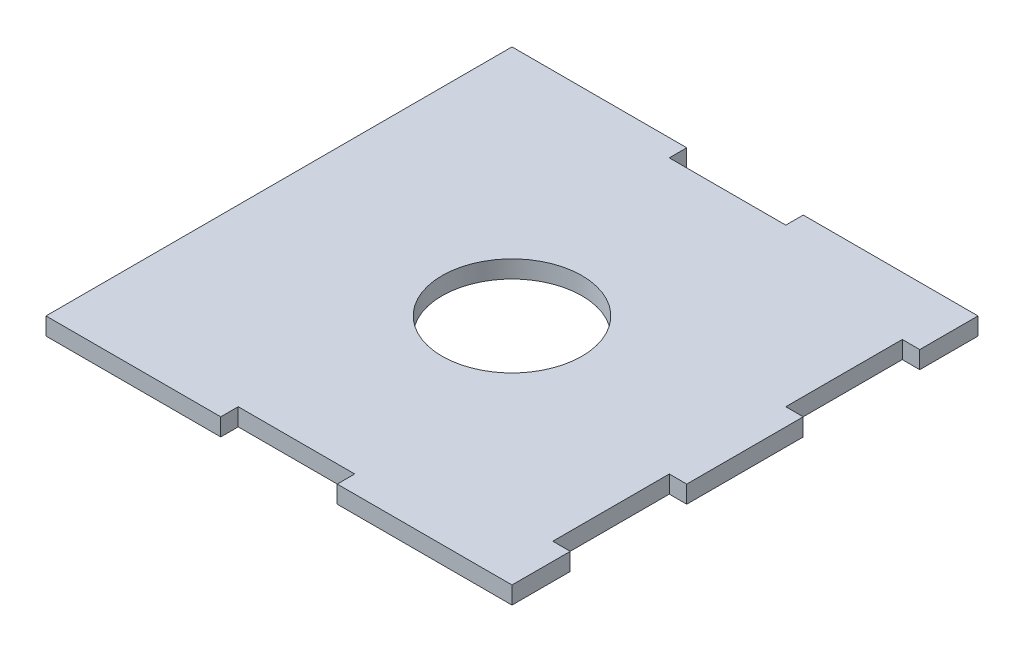
ISO-10303-21;
HEADER;
FILE_DESCRIPTION(('STEP AP214'),'2;1');
FILE_NAME('part.step','',(''),(''),'','','');
FILE_SCHEMA(('AUTOMOTIVE_DESIGN { 1 0 10303 214 1 1 1 1 }'));
ENDSEC;
DATA;
#1=APPLICATION_CONTEXT('core data for automotive mechanical design processes');
#2=APPLICATION_PROTOCOL_DEFINITION('international standard','automotive_design',2000,#1);
#3=PRODUCT_CONTEXT('',#1,'mechanical');
#4=PRODUCT('Part','Part','',(#3));
#5=PRODUCT_RELATED_PRODUCT_CATEGORY('part','',(#4));
#6=PRODUCT_DEFINITION_FORMATION('','',#4);
#7=PRODUCT_DEFINITION_CONTEXT('part definition',#1,'design');
#8=PRODUCT_DEFINITION('design','',#6,#7);
#9=PRODUCT_DEFINITION_SHAPE('','',#8);
#10=(LENGTH_UNIT() NAMED_UNIT(*) SI_UNIT(.MILLI.,.METRE.));
#11=(NAMED_UNIT(*) PLANE_ANGLE_UNIT() SI_UNIT($,.RADIAN.));
#12=(NAMED_UNIT(*) SI_UNIT($,.STERADIAN.) SOLID_ANGLE_UNIT());
#13=UNCERTAINTY_MEASURE_WITH_UNIT(LENGTH_MEASURE(1.E-05),#10,'distance_accuracy_value','');
#14=(GEOMETRIC_REPRESENTATION_CONTEXT(3) GLOBAL_UNCERTAINTY_ASSIGNED_CONTEXT((#13)) GLOBAL_UNIT_ASSIGNED_CONTEXT((#10,
#11,#12)) REPRESENTATION_CONTEXT('',''));
#15=CARTESIAN_POINT('',(0.,0.,0.));
#16=DIRECTION('',(0.,0.,1.));
#17=DIRECTION('',(1.,0.,0.));
#18=AXIS2_PLACEMENT_3D('',#15,#16,#17);
#19=CARTESIAN_POINT('',(0.,3.,0.));
#20=DIRECTION('',(0.,1.,0.));
#21=DIRECTION('',(0.,0.,1.));
#22=AXIS2_PLACEMENT_3D('',#19,#20,#21);
#23=PLANE('',#22);
#24=DIRECTION('',(1.,0.,0.));
#25=VECTOR('',#24,1.);
#26=CARTESIAN_POINT('',(40.,3.,40.));
#27=LINE('',#26,#25);
#28=CARTESIAN_POINT('',(10.0000000000002,3.,40.0000000000003));
#29=VERTEX_POINT('',#28);
#30=CARTESIAN_POINT('',(40.,3.,40.));
#31=VERTEX_POINT('',#30);
#32=EDGE_CURVE('E50',#29,#31,#27,.T.);
#33=ORIENTED_EDGE('',*,*,#32,.T.);
#34=DIRECTION('',(0.,0.,-1.));
#35=VECTOR('',#34,1.);
#36=CARTESIAN_POINT('',(39.9999999999999,3.,30.));
#37=LINE('',#36,#35);
#38=CARTESIAN_POINT('',(39.9999999999999,3.,30.));
#39=VERTEX_POINT('',#38);
#40=EDGE_CURVE('E129',#31,#39,#37,.T.);
#41=ORIENTED_EDGE('',*,*,#40,.T.);
#42=DIRECTION('',(-1.,0.,0.));
#43=VECTOR('',#42,1.);
#44=CARTESIAN_POINT('',(39.9999999999999,3.,30.));
#45=LINE('',#44,#43);
#46=CARTESIAN_POINT('',(36.9999999999998,3.,30.));
#47=VERTEX_POINT('',#46);
#48=EDGE_CURVE('E296',#39,#47,#45,.T.);
#49=ORIENTED_EDGE('',*,*,#48,.T.);
#50=DIRECTION('',(0.,0.,-1.));
#51=VECTOR('',#50,1.);
#52=CARTESIAN_POINT('',(36.9999999999999,3.,10.));
#53=LINE('',#52,#51);
#54=CARTESIAN_POINT('',(36.9999999999999,3.,10.));
#55=VERTEX_POINT('',#54);
#56=EDGE_CURVE('E316',#47,#55,#53,.T.);
#57=ORIENTED_EDGE('',*,*,#56,.T.);
#58=DIRECTION('',(1.,0.,0.));
#59=VECTOR('',#58,1.);
#60=CARTESIAN_POINT('',(36.9999999999999,3.,10.));
#61=LINE('',#60,#59);
#62=CARTESIAN_POINT('',(39.9999999999999,3.,10.));
#63=VERTEX_POINT('',#62);
#64=EDGE_CURVE('E313',#55,#63,#61,.T.);
#65=ORIENTED_EDGE('',*,*,#64,.T.);
#66=DIRECTION('',(0.,0.,-1.));
#67=VECTOR('',#66,1.);
#68=CARTESIAN_POINT('',(39.9999999999999,3.,-10.));
#69=LINE('',#68,#67);
#70=CARTESIAN_POINT('',(39.9999999999999,3.,-10.));
#71=VERTEX_POINT('',#70);
#72=EDGE_CURVE('E315',#63,#71,#69,.T.);
#73=ORIENTED_EDGE('',*,*,#72,.T.);
#74=DIRECTION('',(-1.,0.,0.));
#75=VECTOR('',#74,1.);
#76=CARTESIAN_POINT('',(39.9999999999999,3.,-10.));
#77=LINE('',#76,#75);
#78=CARTESIAN_POINT('',(37.,3.,-10.));
#79=VERTEX_POINT('',#78);
#80=EDGE_CURVE('E318',#71,#79,#77,.T.);
#81=ORIENTED_EDGE('',*,*,#80,.T.);
#82=DIRECTION('',(0.,0.,-1.));
#83=VECTOR('',#82,1.);
#84=CARTESIAN_POINT('',(37.,3.,-30.));
#85=LINE('',#84,#83);
#86=CARTESIAN_POINT('',(37.,3.,-30.));
#87=VERTEX_POINT('',#86);
#88=EDGE_CURVE('E324',#79,#87,#85,.T.);
#89=ORIENTED_EDGE('',*,*,#88,.T.);
#90=DIRECTION('',(1.,0.,0.));
#91=VECTOR('',#90,1.);
#92=CARTESIAN_POINT('',(37.,3.,-30.));
#93=LINE('',#92,#91);
#94=CARTESIAN_POINT('',(40.,3.,-30.));
#95=VERTEX_POINT('',#94);
#96=EDGE_CURVE('E326',#87,#95,#93,.T.);
#97=ORIENTED_EDGE('',*,*,#96,.T.);
#98=DIRECTION('',(0.,0.,-1.));
#99=VECTOR('',#98,1.);
#100=CARTESIAN_POINT('',(40.,3.,-40.));
#101=LINE('',#100,#99);
#102=CARTESIAN_POINT('',(40.,3.,-40.));
#103=VERTEX_POINT('',#102);
#104=EDGE_CURVE('E328',#95,#103,#101,.T.);
#105=ORIENTED_EDGE('',*,*,#104,.T.);
#106=DIRECTION('',(-1.,0.,0.));
#107=VECTOR('',#106,1.);
#108=CARTESIAN_POINT('',(37.,3.,-40.));
#109=LINE('',#108,#107);
#110=CARTESIAN_POINT('',(10.,3.,-40.));
#111=VERTEX_POINT('',#110);
#112=EDGE_CURVE('E330',#103,#111,#109,.T.);
#113=ORIENTED_EDGE('',*,*,#112,.T.);
#114=DIRECTION('',(0.,0.,1.));
#115=VECTOR('',#114,1.);
#116=CARTESIAN_POINT('',(10.,3.,-37.));
#117=LINE('',#116,#115);
#118=CARTESIAN_POINT('',(10.,3.,-37.));
#119=VERTEX_POINT('',#118);
#120=EDGE_CURVE('E332',#111,#119,#117,.T.);
#121=ORIENTED_EDGE('',*,*,#120,.T.);
#122=DIRECTION('',(-1.,0.,0.));
#123=VECTOR('',#122,1.);
#124=CARTESIAN_POINT('',(0.,3.,-37.));
#125=LINE('',#124,#123);
#126=CARTESIAN_POINT('',(-10.,3.,-37.));
#127=VERTEX_POINT('',#126);
#128=EDGE_CURVE('E334',#119,#127,#125,.T.);
#129=ORIENTED_EDGE('',*,*,#128,.T.);
#130=DIRECTION('',(0.,0.,-1.));
#131=VECTOR('',#130,1.);
#132=CARTESIAN_POINT('',(-10.,3.,-37.));
#133=LINE('',#132,#131);
#134=CARTESIAN_POINT('',(-10.,3.,-40.));
#135=VERTEX_POINT('',#134);
#136=EDGE_CURVE('E336',#127,#135,#133,.T.);
#137=ORIENTED_EDGE('',*,*,#136,.T.);
#138=DIRECTION('',(-1.,0.,0.));
#139=VECTOR('',#138,1.);
#140=CARTESIAN_POINT('',(-40.,3.,-40.));
#141=LINE('',#140,#139);
#142=CARTESIAN_POINT('',(-40.,3.,-40.));
#143=VERTEX_POINT('',#142);
#144=EDGE_CURVE('E338',#135,#143,#141,.T.);
#145=ORIENTED_EDGE('',*,*,#144,.T.);
#146=DIRECTION('',(0.,0.,1.));
#147=VECTOR('',#146,1.);
#148=CARTESIAN_POINT('',(-40.,3.,-40.));
#149=LINE('',#148,#147);
#150=CARTESIAN_POINT('',(-40.,3.,40.));
#151=VERTEX_POINT('',#150);
#152=EDGE_CURVE('E340',#143,#151,#149,.T.);
#153=ORIENTED_EDGE('',*,*,#152,.T.);
#154=DIRECTION('',(1.,0.,0.));
#155=VECTOR('',#154,1.);
#156=CARTESIAN_POINT('',(-40.,3.,40.));
#157=LINE('',#156,#155);
#158=CARTESIAN_POINT('',(-9.99999999999984,3.,39.9999999999999));
#159=VERTEX_POINT('',#158);
#160=EDGE_CURVE('E185',#151,#159,#157,.T.);
#161=ORIENTED_EDGE('',*,*,#160,.T.);
#162=DIRECTION('',(0.,0.,-1.));
#163=VECTOR('',#162,1.);
#164=CARTESIAN_POINT('',(-9.99999999999985,3.,36.9999999999999));
#165=LINE('',#164,#163);
#166=CARTESIAN_POINT('',(-9.99999999999985,3.,36.9999999999999));
#167=VERTEX_POINT('',#166);
#168=EDGE_CURVE('E179',#159,#167,#165,.T.);
#169=ORIENTED_EDGE('',*,*,#168,.T.);
#170=DIRECTION('',(1.,0.,0.));
#171=VECTOR('',#170,1.);
#172=CARTESIAN_POINT('',(1.53023059925703E-13,3.,36.9999999999999));
#173=LINE('',#172,#171);
#174=CARTESIAN_POINT('',(10.0000000000002,3.,36.9999999999998));
#175=VERTEX_POINT('',#174);
#176=EDGE_CURVE('E183',#167,#175,#173,.T.);
#177=ORIENTED_EDGE('',*,*,#176,.T.);
#178=DIRECTION('',(0.,0.,1.));
#179=VECTOR('',#178,1.);
#180=CARTESIAN_POINT('',(10.0000000000002,3.,36.9999999999998));
#181=LINE('',#180,#179);
#182=EDGE_CURVE('E200',#175,#29,#181,.T.);
#183=ORIENTED_EDGE('',*,*,#182,.T.);
#184=EDGE_LOOP('',(#33,#41,#49,#57,#65,#73,#81,#89,#97,#105,#113,#121,#129,#137,#145,#153,#161,
#169,#177,#183));
#185=FACE_BOUND('',#184,.T.);
#186=CARTESIAN_POINT('',(0.,3.,0.));
#187=DIRECTION('',(0.,1.,0.));
#188=DIRECTION('',(0.,0.,1.));
#189=AXIS2_PLACEMENT_3D('',#186,#187,#188);
#190=CIRCLE('',#189,12.);
#191=CARTESIAN_POINT('',(0.,3.,12.));
#192=VERTEX_POINT('',#191);
#193=EDGE_CURVE('E209',#192,#192,#190,.T.);
#194=ORIENTED_EDGE('',*,*,#193,.F.);
#195=EDGE_LOOP('',(#194));
#196=FACE_BOUND('',#195,.T.);
#197=ADVANCED_FACE('F33',(#185,#196),#23,.T.);
#198=CARTESIAN_POINT('',(0.,0.,0.));
#199=DIRECTION('',(0.,1.,0.));
#200=DIRECTION('',(0.,0.,1.));
#201=AXIS2_PLACEMENT_3D('',#198,#199,#200);
#202=PLANE('',#201);
#203=DIRECTION('',(0.,0.,-1.));
#204=VECTOR('',#203,1.);
#205=CARTESIAN_POINT('',(39.9999999999999,0.,30.));
#206=LINE('',#205,#204);
#207=CARTESIAN_POINT('',(40.,0.,40.));
#208=VERTEX_POINT('',#207);
#209=CARTESIAN_POINT('',(39.9999999999999,0.,30.));
#210=VERTEX_POINT('',#209);
#211=EDGE_CURVE('E206',#208,#210,#206,.T.);
#212=ORIENTED_EDGE('',*,*,#211,.F.);
#213=DIRECTION('',(1.,0.,0.));
#214=VECTOR('',#213,1.);
#215=CARTESIAN_POINT('',(10.0000000000002,0.,40.0000000000003));
#216=LINE('',#215,#214);
#217=CARTESIAN_POINT('',(10.0000000000002,0.,40.0000000000003));
#218=VERTEX_POINT('',#217);
#219=EDGE_CURVE('E244',#218,#208,#216,.T.);
#220=ORIENTED_EDGE('',*,*,#219,.F.);
#221=DIRECTION('',(0.,0.,1.));
#222=VECTOR('',#221,1.);
#223=CARTESIAN_POINT('',(10.0000000000002,0.,36.9999999999998));
#224=LINE('',#223,#222);
#225=CARTESIAN_POINT('',(10.0000000000002,0.,36.9999999999998));
#226=VERTEX_POINT('',#225);
#227=EDGE_CURVE('E122',#226,#218,#224,.T.);
#228=ORIENTED_EDGE('',*,*,#227,.F.);
#229=DIRECTION('',(1.,0.,0.));
#230=VECTOR('',#229,1.);
#231=CARTESIAN_POINT('',(1.53023059925703E-13,0.,36.9999999999999));
#232=LINE('',#231,#230);
#233=CARTESIAN_POINT('',(-9.99999999999985,0.,36.9999999999999));
#234=VERTEX_POINT('',#233);
#235=EDGE_CURVE('E115',#234,#226,#232,.T.);
#236=ORIENTED_EDGE('',*,*,#235,.F.);
#237=DIRECTION('',(0.,0.,-1.));
#238=VECTOR('',#237,1.);
#239=CARTESIAN_POINT('',(-9.99999999999985,0.,36.9999999999999));
#240=LINE('',#239,#238);
#241=CARTESIAN_POINT('',(-9.99999999999984,0.,39.9999999999999));
#242=VERTEX_POINT('',#241);
#243=EDGE_CURVE('E194',#242,#234,#240,.T.);
#244=ORIENTED_EDGE('',*,*,#243,.F.);
#245=DIRECTION('',(1.,0.,0.));
#246=VECTOR('',#245,1.);
#247=CARTESIAN_POINT('',(-40.,0.,40.));
#248=LINE('',#247,#246);
#249=CARTESIAN_POINT('',(-40.,0.,40.));
#250=VERTEX_POINT('',#249);
#251=EDGE_CURVE('E239',#250,#242,#248,.T.);
#252=ORIENTED_EDGE('',*,*,#251,.F.);
#253=DIRECTION('',(0.,0.,1.));
#254=VECTOR('',#253,1.);
#255=CARTESIAN_POINT('',(-40.,0.,-40.));
#256=LINE('',#255,#254);
#257=CARTESIAN_POINT('',(-40.,0.,-40.));
#258=VERTEX_POINT('',#257);
#259=EDGE_CURVE('E237',#258,#250,#256,.T.);
#260=ORIENTED_EDGE('',*,*,#259,.F.);
#261=DIRECTION('',(-1.,0.,0.));
#262=VECTOR('',#261,1.);
#263=CARTESIAN_POINT('',(-40.,0.,-40.));
#264=LINE('',#263,#262);
#265=CARTESIAN_POINT('',(-10.,0.,-40.));
#266=VERTEX_POINT('',#265);
#267=EDGE_CURVE('E235',#266,#258,#264,.T.);
#268=ORIENTED_EDGE('',*,*,#267,.F.);
#269=DIRECTION('',(0.,0.,-1.));
#270=VECTOR('',#269,1.);
#271=CARTESIAN_POINT('',(-10.,0.,-37.));
#272=LINE('',#271,#270);
#273=CARTESIAN_POINT('',(-10.,0.,-37.));
#274=VERTEX_POINT('',#273);
#275=EDGE_CURVE('E233',#274,#266,#272,.T.);
#276=ORIENTED_EDGE('',*,*,#275,.F.);
#277=DIRECTION('',(-1.,0.,0.));
#278=VECTOR('',#277,1.);
#279=CARTESIAN_POINT('',(0.,0.,-37.));
#280=LINE('',#279,#278);
#281=CARTESIAN_POINT('',(10.,0.,-37.));
#282=VERTEX_POINT('',#281);
#283=EDGE_CURVE('E231',#282,#274,#280,.T.);
#284=ORIENTED_EDGE('',*,*,#283,.F.);
#285=DIRECTION('',(0.,0.,1.));
#286=VECTOR('',#285,1.);
#287=CARTESIAN_POINT('',(10.,0.,-37.));
#288=LINE('',#287,#286);
#289=CARTESIAN_POINT('',(10.,0.,-40.));
#290=VERTEX_POINT('',#289);
#291=EDGE_CURVE('E228',#290,#282,#288,.T.);
#292=ORIENTED_EDGE('',*,*,#291,.F.);
#293=DIRECTION('',(-1.,0.,0.));
#294=VECTOR('',#293,1.);
#295=CARTESIAN_POINT('',(10.,0.,-40.));
#296=LINE('',#295,#294);
#297=CARTESIAN_POINT('',(40.,0.,-40.));
#298=VERTEX_POINT('',#297);
#299=EDGE_CURVE('E226',#298,#290,#296,.T.);
#300=ORIENTED_EDGE('',*,*,#299,.F.);
#301=DIRECTION('',(0.,0.,-1.));
#302=VECTOR('',#301,1.);
#303=CARTESIAN_POINT('',(40.,0.,-40.));
#304=LINE('',#303,#302);
#305=CARTESIAN_POINT('',(40.,0.,-30.));
#306=VERTEX_POINT('',#305);
#307=EDGE_CURVE('E223',#306,#298,#304,.T.);
#308=ORIENTED_EDGE('',*,*,#307,.F.);
#309=DIRECTION('',(1.,0.,0.));
#310=VECTOR('',#309,1.);
#311=CARTESIAN_POINT('',(37.,0.,-30.));
#312=LINE('',#311,#310);
#313=CARTESIAN_POINT('',(37.,0.,-30.));
#314=VERTEX_POINT('',#313);
#315=EDGE_CURVE('E221',#314,#306,#312,.T.);
#316=ORIENTED_EDGE('',*,*,#315,.F.);
#317=DIRECTION('',(0.,0.,-1.));
#318=VECTOR('',#317,1.);
#319=CARTESIAN_POINT('',(37.,0.,-30.));
#320=LINE('',#319,#318);
#321=CARTESIAN_POINT('',(37.,0.,-10.));
#322=VERTEX_POINT('',#321);
#323=EDGE_CURVE('E219',#322,#314,#320,.T.);
#324=ORIENTED_EDGE('',*,*,#323,.F.);
#325=DIRECTION('',(-1.,0.,0.));
#326=VECTOR('',#325,1.);
#327=CARTESIAN_POINT('',(39.9999999999999,0.,-10.));
#328=LINE('',#327,#326);
#329=CARTESIAN_POINT('',(39.9999999999999,0.,-10.));
#330=VERTEX_POINT('',#329);
#331=EDGE_CURVE('E217',#330,#322,#328,.T.);
#332=ORIENTED_EDGE('',*,*,#331,.F.);
#333=DIRECTION('',(0.,0.,-1.));
#334=VECTOR('',#333,1.);
#335=CARTESIAN_POINT('',(39.9999999999999,0.,-10.));
#336=LINE('',#335,#334);
#337=CARTESIAN_POINT('',(39.9999999999999,0.,10.));
#338=VERTEX_POINT('',#337);
#339=EDGE_CURVE('E215',#338,#330,#336,.T.);
#340=ORIENTED_EDGE('',*,*,#339,.F.);
#341=DIRECTION('',(1.,0.,0.));
#342=VECTOR('',#341,1.);
#343=CARTESIAN_POINT('',(36.9999999999999,0.,10.));
#344=LINE('',#343,#342);
#345=CARTESIAN_POINT('',(36.9999999999999,0.,10.));
#346=VERTEX_POINT('',#345);
#347=EDGE_CURVE('E213',#346,#338,#344,.T.);
#348=ORIENTED_EDGE('',*,*,#347,.F.);
#349=DIRECTION('',(0.,0.,-1.));
#350=VECTOR('',#349,1.);
#351=CARTESIAN_POINT('',(36.9999999999999,0.,10.));
#352=LINE('',#351,#350);
#353=CARTESIAN_POINT('',(36.9999999999998,0.,30.));
#354=VERTEX_POINT('',#353);
#355=EDGE_CURVE('E211',#354,#346,#352,.T.);
#356=ORIENTED_EDGE('',*,*,#355,.F.);
#357=DIRECTION('',(-1.,0.,0.));
#358=VECTOR('',#357,1.);
#359=CARTESIAN_POINT('',(39.9999999999999,0.,30.));
#360=LINE('',#359,#358);
#361=EDGE_CURVE('E208',#210,#354,#360,.T.);
#362=ORIENTED_EDGE('',*,*,#361,.F.);
#363=EDGE_LOOP('',(#212,#220,#228,#236,#244,#252,#260,#268,#276,#284,#292,#300,#308,#316,#324,
#332,#340,#348,#356,#362));
#364=FACE_BOUND('',#363,.T.);
#365=CARTESIAN_POINT('',(0.,0.,0.));
#366=DIRECTION('',(0.,1.,0.));
#367=DIRECTION('',(0.,0.,1.));
#368=AXIS2_PLACEMENT_3D('',#365,#366,#367);
#369=CIRCLE('',#368,12.);
#370=CARTESIAN_POINT('',(0.,0.,12.));
#371=VERTEX_POINT('',#370);
#372=EDGE_CURVE('E356',#371,#371,#369,.T.);
#373=ORIENTED_EDGE('',*,*,#372,.T.);
#374=EDGE_LOOP('',(#373));
#375=FACE_BOUND('',#374,.T.);
#376=ADVANCED_FACE('F300',(#364,#375),#202,.F.);
#377=CARTESIAN_POINT('',(39.9999999999999,3.,30.));
#378=DIRECTION('',(-1.,0.,0.));
#379=DIRECTION('',(0.,0.,1.));
#380=AXIS2_PLACEMENT_3D('',#377,#378,#379);
#381=PLANE('',#380);
#382=ORIENTED_EDGE('',*,*,#211,.T.);
#383=DIRECTION('',(0.,-1.,0.));
#384=VECTOR('',#383,1.);
#385=CARTESIAN_POINT('',(39.9999999999999,3.,30.));
#386=LINE('',#385,#384);
#387=EDGE_CURVE('E42',#39,#210,#386,.T.);
#388=ORIENTED_EDGE('',*,*,#387,.F.);
#389=ORIENTED_EDGE('',*,*,#40,.F.);
#390=DIRECTION('',(0.,-1.,0.));
#391=VECTOR('',#390,1.);
#392=CARTESIAN_POINT('',(40.,3.,40.));
#393=LINE('',#392,#391);
#394=EDGE_CURVE('E11',#31,#208,#393,.T.);
#395=ORIENTED_EDGE('',*,*,#394,.T.);
#396=EDGE_LOOP('',(#382,#388,#389,#395));
#397=FACE_BOUND('',#396,.T.);
#398=ADVANCED_FACE('F35',(#397),#381,.F.);
#399=CARTESIAN_POINT('',(39.9999999999999,3.,30.));
#400=DIRECTION('',(0.,0.,1.));
#401=DIRECTION('',(1.,0.,0.));
#402=AXIS2_PLACEMENT_3D('',#399,#400,#401);
#403=PLANE('',#402);
#404=ORIENTED_EDGE('',*,*,#361,.T.);
#405=DIRECTION('',(0.,-1.,0.));
#406=VECTOR('',#405,1.);
#407=CARTESIAN_POINT('',(36.9999999999998,3.,30.));
#408=LINE('',#407,#406);
#409=EDGE_CURVE('E288',#47,#354,#408,.T.);
#410=ORIENTED_EDGE('',*,*,#409,.F.);
#411=ORIENTED_EDGE('',*,*,#48,.F.);
#412=ORIENTED_EDGE('',*,*,#387,.T.);
#413=EDGE_LOOP('',(#404,#410,#411,#412));
#414=FACE_BOUND('',#413,.T.);
#415=ADVANCED_FACE('F294',(#414),#403,.F.);
#416=CARTESIAN_POINT('',(36.9999999999999,3.,10.));
#417=DIRECTION('',(-1.,0.,0.));
#418=DIRECTION('',(0.,0.,1.));
#419=AXIS2_PLACEMENT_3D('',#416,#417,#418);
#420=PLANE('',#419);
#421=ORIENTED_EDGE('',*,*,#355,.T.);
#422=DIRECTION('',(0.,-1.,0.));
#423=VECTOR('',#422,1.);
#424=CARTESIAN_POINT('',(36.9999999999999,3.,10.));
#425=LINE('',#424,#423);
#426=EDGE_CURVE('E285',#55,#346,#425,.T.);
#427=ORIENTED_EDGE('',*,*,#426,.F.);
#428=ORIENTED_EDGE('',*,*,#56,.F.);
#429=ORIENTED_EDGE('',*,*,#409,.T.);
#430=EDGE_LOOP('',(#421,#427,#428,#429));
#431=FACE_BOUND('',#430,.T.);
#432=ADVANCED_FACE('F307',(#431),#420,.F.);
#433=CARTESIAN_POINT('',(36.9999999999999,3.,10.));
#434=DIRECTION('',(0.,0.,-1.));
#435=DIRECTION('',(-1.,0.,0.));
#436=AXIS2_PLACEMENT_3D('',#433,#434,#435);
#437=PLANE('',#436);
#438=ORIENTED_EDGE('',*,*,#347,.T.);
#439=DIRECTION('',(0.,-1.,0.));
#440=VECTOR('',#439,1.);
#441=CARTESIAN_POINT('',(39.9999999999999,3.,10.));
#442=LINE('',#441,#440);
#443=EDGE_CURVE('E282',#63,#338,#442,.T.);
#444=ORIENTED_EDGE('',*,*,#443,.F.);
#445=ORIENTED_EDGE('',*,*,#64,.F.);
#446=ORIENTED_EDGE('',*,*,#426,.T.);
#447=EDGE_LOOP('',(#438,#444,#445,#446));
#448=FACE_BOUND('',#447,.T.);
#449=ADVANCED_FACE('F311',(#448),#437,.F.);
#450=CARTESIAN_POINT('',(39.9999999999999,3.,-10.));
#451=DIRECTION('',(-1.,0.,0.));
#452=DIRECTION('',(0.,0.,1.));
#453=AXIS2_PLACEMENT_3D('',#450,#451,#452);
#454=PLANE('',#453);
#455=ORIENTED_EDGE('',*,*,#339,.T.);
#456=DIRECTION('',(0.,-1.,0.));
#457=VECTOR('',#456,1.);
#458=CARTESIAN_POINT('',(39.9999999999999,3.,-10.));
#459=LINE('',#458,#457);
#460=EDGE_CURVE('E279',#71,#330,#459,.T.);
#461=ORIENTED_EDGE('',*,*,#460,.F.);
#462=ORIENTED_EDGE('',*,*,#72,.F.);
#463=ORIENTED_EDGE('',*,*,#443,.T.);
#464=EDGE_LOOP('',(#455,#461,#462,#463));
#465=FACE_BOUND('',#464,.T.);
#466=ADVANCED_FACE('F419',(#465),#454,.F.);
#467=CARTESIAN_POINT('',(39.9999999999999,3.,-10.));
#468=DIRECTION('',(0.,0.,1.));
#469=DIRECTION('',(1.,0.,0.));
#470=AXIS2_PLACEMENT_3D('',#467,#468,#469);
#471=PLANE('',#470);
#472=ORIENTED_EDGE('',*,*,#331,.T.);
#473=DIRECTION('',(0.,-1.,0.));
#474=VECTOR('',#473,1.);
#475=CARTESIAN_POINT('',(37.,3.,-10.));
#476=LINE('',#475,#474);
#477=EDGE_CURVE('E276',#79,#322,#476,.T.);
#478=ORIENTED_EDGE('',*,*,#477,.F.);
#479=ORIENTED_EDGE('',*,*,#80,.F.);
#480=ORIENTED_EDGE('',*,*,#460,.T.);
#481=EDGE_LOOP('',(#472,#478,#479,#480));
#482=FACE_BOUND('',#481,.T.);
#483=ADVANCED_FACE('F415',(#482),#471,.F.);
#484=CARTESIAN_POINT('',(37.,3.,-30.));
#485=DIRECTION('',(-1.,0.,0.));
#486=DIRECTION('',(0.,0.,1.));
#487=AXIS2_PLACEMENT_3D('',#484,#485,#486);
#488=PLANE('',#487);
#489=ORIENTED_EDGE('',*,*,#323,.T.);
#490=DIRECTION('',(0.,-1.,0.));
#491=VECTOR('',#490,1.);
#492=CARTESIAN_POINT('',(37.,3.,-30.));
#493=LINE('',#492,#491);
#494=EDGE_CURVE('E273',#87,#314,#493,.T.);
#495=ORIENTED_EDGE('',*,*,#494,.F.);
#496=ORIENTED_EDGE('',*,*,#88,.F.);
#497=ORIENTED_EDGE('',*,*,#477,.T.);
#498=EDGE_LOOP('',(#489,#495,#496,#497));
#499=FACE_BOUND('',#498,.T.);
#500=ADVANCED_FACE('F411',(#499),#488,.F.);
#501=CARTESIAN_POINT('',(37.,3.,-30.));
#502=DIRECTION('',(0.,0.,-1.));
#503=DIRECTION('',(-1.,0.,0.));
#504=AXIS2_PLACEMENT_3D('',#501,#502,#503);
#505=PLANE('',#504);
#506=ORIENTED_EDGE('',*,*,#315,.T.);
#507=DIRECTION('',(0.,-1.,0.));
#508=VECTOR('',#507,1.);
#509=CARTESIAN_POINT('',(40.,3.,-30.));
#510=LINE('',#509,#508);
#511=EDGE_CURVE('E270',#95,#306,#510,.T.);
#512=ORIENTED_EDGE('',*,*,#511,.F.);
#513=ORIENTED_EDGE('',*,*,#96,.F.);
#514=ORIENTED_EDGE('',*,*,#494,.T.);
#515=EDGE_LOOP('',(#506,#512,#513,#514));
#516=FACE_BOUND('',#515,.T.);
#517=ADVANCED_FACE('F407',(#516),#505,.F.);
#518=CARTESIAN_POINT('',(40.,3.,-40.));
#519=DIRECTION('',(-1.,0.,0.));
#520=DIRECTION('',(0.,0.,1.));
#521=AXIS2_PLACEMENT_3D('',#518,#519,#520);
#522=PLANE('',#521);
#523=ORIENTED_EDGE('',*,*,#307,.T.);
#524=DIRECTION('',(0.,-1.,0.));
#525=VECTOR('',#524,1.);
#526=CARTESIAN_POINT('',(40.,3.,-40.));
#527=LINE('',#526,#525);
#528=EDGE_CURVE('E267',#103,#298,#527,.T.);
#529=ORIENTED_EDGE('',*,*,#528,.F.);
#530=ORIENTED_EDGE('',*,*,#104,.F.);
#531=ORIENTED_EDGE('',*,*,#511,.T.);
#532=EDGE_LOOP('',(#523,#529,#530,#531));
#533=FACE_BOUND('',#532,.T.);
#534=ADVANCED_FACE('F403',(#533),#522,.F.);
#535=CARTESIAN_POINT('',(10.,3.,-40.));
#536=DIRECTION('',(0.,0.,1.));
#537=DIRECTION('',(1.,0.,0.));
#538=AXIS2_PLACEMENT_3D('',#535,#536,#537);
#539=PLANE('',#538);
#540=ORIENTED_EDGE('',*,*,#299,.T.);
#541=DIRECTION('',(0.,-1.,0.));
#542=VECTOR('',#541,1.);
#543=CARTESIAN_POINT('',(10.,3.,-40.));
#544=LINE('',#543,#542);
#545=EDGE_CURVE('E264',#111,#290,#544,.T.);
#546=ORIENTED_EDGE('',*,*,#545,.F.);
#547=ORIENTED_EDGE('',*,*,#112,.F.);
#548=ORIENTED_EDGE('',*,*,#528,.T.);
#549=EDGE_LOOP('',(#540,#546,#547,#548));
#550=FACE_BOUND('',#549,.T.);
#551=ADVANCED_FACE('F399',(#550),#539,.F.);
#552=CARTESIAN_POINT('',(10.,3.,-37.));
#553=DIRECTION('',(1.,0.,0.));
#554=DIRECTION('',(0.,0.,-1.));
#555=AXIS2_PLACEMENT_3D('',#552,#553,#554);
#556=PLANE('',#555);
#557=ORIENTED_EDGE('',*,*,#291,.T.);
#558=DIRECTION('',(0.,-1.,0.));
#559=VECTOR('',#558,1.);
#560=CARTESIAN_POINT('',(10.,3.,-37.));
#561=LINE('',#560,#559);
#562=EDGE_CURVE('E261',#119,#282,#561,.T.);
#563=ORIENTED_EDGE('',*,*,#562,.F.);
#564=ORIENTED_EDGE('',*,*,#120,.F.);
#565=ORIENTED_EDGE('',*,*,#545,.T.);
#566=EDGE_LOOP('',(#557,#563,#564,#565));
#567=FACE_BOUND('',#566,.T.);
#568=ADVANCED_FACE('F395',(#567),#556,.F.);
#569=CARTESIAN_POINT('',(0.,3.,-37.));
#570=DIRECTION('',(0.,0.,1.));
#571=DIRECTION('',(1.,0.,0.));
#572=AXIS2_PLACEMENT_3D('',#569,#570,#571);
#573=PLANE('',#572);
#574=ORIENTED_EDGE('',*,*,#283,.T.);
#575=DIRECTION('',(0.,-1.,0.));
#576=VECTOR('',#575,1.);
#577=CARTESIAN_POINT('',(-10.,3.,-37.));
#578=LINE('',#577,#576);
#579=EDGE_CURVE('E258',#127,#274,#578,.T.);
#580=ORIENTED_EDGE('',*,*,#579,.F.);
#581=ORIENTED_EDGE('',*,*,#128,.F.);
#582=ORIENTED_EDGE('',*,*,#562,.T.);
#583=EDGE_LOOP('',(#574,#580,#581,#582));
#584=FACE_BOUND('',#583,.T.);
#585=ADVANCED_FACE('F391',(#584),#573,.F.);
#586=CARTESIAN_POINT('',(-10.,3.,-37.));
#587=DIRECTION('',(-1.,0.,0.));
#588=DIRECTION('',(0.,0.,1.));
#589=AXIS2_PLACEMENT_3D('',#586,#587,#588);
#590=PLANE('',#589);
#591=ORIENTED_EDGE('',*,*,#275,.T.);
#592=DIRECTION('',(0.,-1.,0.));
#593=VECTOR('',#592,1.);
#594=CARTESIAN_POINT('',(-10.,3.,-40.));
#595=LINE('',#594,#593);
#596=EDGE_CURVE('E255',#135,#266,#595,.T.);
#597=ORIENTED_EDGE('',*,*,#596,.F.);
#598=ORIENTED_EDGE('',*,*,#136,.F.);
#599=ORIENTED_EDGE('',*,*,#579,.T.);
#600=EDGE_LOOP('',(#591,#597,#598,#599));
#601=FACE_BOUND('',#600,.T.);
#602=ADVANCED_FACE('F387',(#601),#590,.F.);
#603=CARTESIAN_POINT('',(-40.,3.,-40.));
#604=DIRECTION('',(0.,0.,1.));
#605=DIRECTION('',(1.,0.,0.));
#606=AXIS2_PLACEMENT_3D('',#603,#604,#605);
#607=PLANE('',#606);
#608=ORIENTED_EDGE('',*,*,#267,.T.);
#609=DIRECTION('',(0.,-1.,0.));
#610=VECTOR('',#609,1.);
#611=CARTESIAN_POINT('',(-40.,3.,-40.));
#612=LINE('',#611,#610);
#613=EDGE_CURVE('E252',#143,#258,#612,.T.);
#614=ORIENTED_EDGE('',*,*,#613,.F.);
#615=ORIENTED_EDGE('',*,*,#144,.F.);
#616=ORIENTED_EDGE('',*,*,#596,.T.);
#617=EDGE_LOOP('',(#608,#614,#615,#616));
#618=FACE_BOUND('',#617,.T.);
#619=ADVANCED_FACE('F384',(#618),#607,.F.);
#620=CARTESIAN_POINT('',(-40.,3.,-40.));
#621=DIRECTION('',(1.,0.,0.));
#622=DIRECTION('',(0.,0.,-1.));
#623=AXIS2_PLACEMENT_3D('',#620,#621,#622);
#624=PLANE('',#623);
#625=ORIENTED_EDGE('',*,*,#259,.T.);
#626=DIRECTION('',(0.,-1.,0.));
#627=VECTOR('',#626,1.);
#628=CARTESIAN_POINT('',(-40.,3.,40.));
#629=LINE('',#628,#627);
#630=EDGE_CURVE('E249',#151,#250,#629,.T.);
#631=ORIENTED_EDGE('',*,*,#630,.F.);
#632=ORIENTED_EDGE('',*,*,#152,.F.);
#633=ORIENTED_EDGE('',*,*,#613,.T.);
#634=EDGE_LOOP('',(#625,#631,#632,#633));
#635=FACE_BOUND('',#634,.T.);
#636=ADVANCED_FACE('F346',(#635),#624,.F.);
#637=CARTESIAN_POINT('',(-40.,3.,40.));
#638=DIRECTION('',(0.,0.,-1.));
#639=DIRECTION('',(-1.,0.,0.));
#640=AXIS2_PLACEMENT_3D('',#637,#638,#639);
#641=PLANE('',#640);
#642=ORIENTED_EDGE('',*,*,#251,.T.);
#643=DIRECTION('',(0.,-1.,0.));
#644=VECTOR('',#643,1.);
#645=CARTESIAN_POINT('',(-9.99999999999984,3.,39.9999999999999));
#646=LINE('',#645,#644);
#647=EDGE_CURVE('E195',#159,#242,#646,.T.);
#648=ORIENTED_EDGE('',*,*,#647,.F.);
#649=ORIENTED_EDGE('',*,*,#160,.F.);
#650=ORIENTED_EDGE('',*,*,#630,.T.);
#651=EDGE_LOOP('',(#642,#648,#649,#650));
#652=FACE_BOUND('',#651,.T.);
#653=ADVANCED_FACE('F350',(#652),#641,.F.);
#654=CARTESIAN_POINT('',(-9.99999999999985,3.,36.9999999999999));
#655=DIRECTION('',(-1.,0.,0.));
#656=DIRECTION('',(0.,0.,1.));
#657=AXIS2_PLACEMENT_3D('',#654,#655,#656);
#658=PLANE('',#657);
#659=ORIENTED_EDGE('',*,*,#243,.T.);
#660=DIRECTION('',(0.,-1.,0.));
#661=VECTOR('',#660,1.);
#662=CARTESIAN_POINT('',(-9.99999999999985,3.,36.9999999999999));
#663=LINE('',#662,#661);
#664=EDGE_CURVE('E191',#167,#234,#663,.T.);
#665=ORIENTED_EDGE('',*,*,#664,.F.);
#666=ORIENTED_EDGE('',*,*,#168,.F.);
#667=ORIENTED_EDGE('',*,*,#647,.T.);
#668=EDGE_LOOP('',(#659,#665,#666,#667));
#669=FACE_BOUND('',#668,.T.);
#670=ADVANCED_FACE('F192',(#669),#658,.F.);
#671=CARTESIAN_POINT('',(1.53023059925703E-13,3.,36.9999999999999));
#672=DIRECTION('',(0.,0.,-1.));
#673=DIRECTION('',(-1.,0.,0.));
#674=AXIS2_PLACEMENT_3D('',#671,#672,#673);
#675=PLANE('',#674);
#676=ORIENTED_EDGE('',*,*,#235,.T.);
#677=DIRECTION('',(0.,-1.,0.));
#678=VECTOR('',#677,1.);
#679=CARTESIAN_POINT('',(10.0000000000002,3.,36.9999999999998));
#680=LINE('',#679,#678);
#681=EDGE_CURVE('E196',#175,#226,#680,.T.);
#682=ORIENTED_EDGE('',*,*,#681,.F.);
#683=ORIENTED_EDGE('',*,*,#176,.F.);
#684=ORIENTED_EDGE('',*,*,#664,.T.);
#685=EDGE_LOOP('',(#676,#682,#683,#684));
#686=FACE_BOUND('',#685,.T.);
#687=ADVANCED_FACE('F198',(#686),#675,.F.);
#688=CARTESIAN_POINT('',(10.0000000000002,3.,36.9999999999998));
#689=DIRECTION('',(1.,0.,0.));
#690=DIRECTION('',(0.,0.,-1.));
#691=AXIS2_PLACEMENT_3D('',#688,#689,#690);
#692=PLANE('',#691);
#693=ORIENTED_EDGE('',*,*,#227,.T.);
#694=DIRECTION('',(0.,-1.,0.));
#695=VECTOR('',#694,1.);
#696=CARTESIAN_POINT('',(10.0000000000002,3.,40.0000000000003));
#697=LINE('',#696,#695);
#698=EDGE_CURVE('E202',#29,#218,#697,.T.);
#699=ORIENTED_EDGE('',*,*,#698,.F.);
#700=ORIENTED_EDGE('',*,*,#182,.F.);
#701=ORIENTED_EDGE('',*,*,#681,.T.);
#702=EDGE_LOOP('',(#693,#699,#700,#701));
#703=FACE_BOUND('',#702,.T.);
#704=ADVANCED_FACE('F352',(#703),#692,.F.);
#705=CARTESIAN_POINT('',(10.0000000000002,3.,40.0000000000003));
#706=DIRECTION('',(0.,0.,-1.));
#707=DIRECTION('',(-1.,0.,0.));
#708=AXIS2_PLACEMENT_3D('',#705,#706,#707);
#709=PLANE('',#708);
#710=ORIENTED_EDGE('',*,*,#219,.T.);
#711=ORIENTED_EDGE('',*,*,#394,.F.);
#712=ORIENTED_EDGE('',*,*,#32,.F.);
#713=ORIENTED_EDGE('',*,*,#698,.T.);
#714=EDGE_LOOP('',(#710,#711,#712,#713));
#715=FACE_BOUND('',#714,.T.);
#716=ADVANCED_FACE('F351',(#715),#709,.F.);
#717=CARTESIAN_POINT('',(0.,3.,0.));
#718=DIRECTION('',(0.,-1.,0.));
#719=DIRECTION('',(0.,0.,-1.));
#720=AXIS2_PLACEMENT_3D('',#717,#718,#719);
#721=CYLINDRICAL_SURFACE('',#720,12.);
#722=ORIENTED_EDGE('',*,*,#193,.T.);
#723=EDGE_LOOP('',(#722));
#724=FACE_BOUND('',#723,.T.);
#725=ORIENTED_EDGE('',*,*,#372,.F.);
#726=EDGE_LOOP('',(#725));
#727=FACE_BOUND('',#726,.T.);
#728=ADVANCED_FACE('F362',(#724,#727),#721,.F.);
#729=CLOSED_SHELL('',(#197,#376,#398,#415,#432,#449,#466,#483,#500,#517,#534,#551,#568,#585,
#602,#619,#636,#653,#670,#687,#704,#716,#728));
#730=MANIFOLD_SOLID_BREP('B2',#729);
#731=ADVANCED_BREP_SHAPE_REPRESENTATION('',(#18,#730),#14);
#732=SHAPE_DEFINITION_REPRESENTATION(#9,#731);
ENDSEC;
END-ISO-10303-21;
